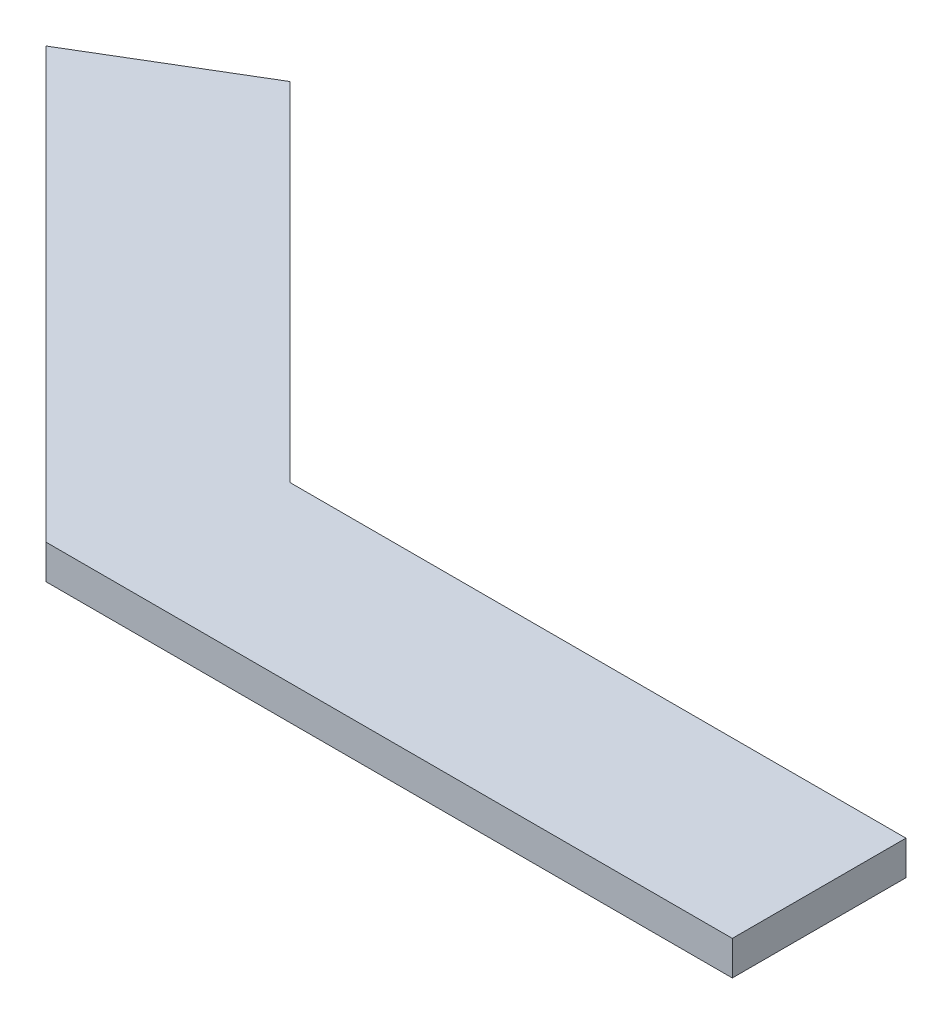
ISO-10303-21;
HEADER;
FILE_DESCRIPTION(('STEP AP214'),'2;1');
FILE_NAME('part.step','',(''),(''),'','','');
FILE_SCHEMA(('AUTOMOTIVE_DESIGN { 1 0 10303 214 1 1 1 1 }'));
ENDSEC;
DATA;
#1=APPLICATION_CONTEXT('core data for automotive mechanical design processes');
#2=APPLICATION_PROTOCOL_DEFINITION('international standard','automotive_design',2000,#1);
#3=PRODUCT_CONTEXT('',#1,'mechanical');
#4=PRODUCT('Part','Part','',(#3));
#5=PRODUCT_RELATED_PRODUCT_CATEGORY('part','',(#4));
#6=PRODUCT_DEFINITION_FORMATION('','',#4);
#7=PRODUCT_DEFINITION_CONTEXT('part definition',#1,'design');
#8=PRODUCT_DEFINITION('design','',#6,#7);
#9=PRODUCT_DEFINITION_SHAPE('','',#8);
#10=(LENGTH_UNIT() NAMED_UNIT(*) SI_UNIT(.MILLI.,.METRE.));
#11=(NAMED_UNIT(*) PLANE_ANGLE_UNIT() SI_UNIT($,.RADIAN.));
#12=(NAMED_UNIT(*) SI_UNIT($,.STERADIAN.) SOLID_ANGLE_UNIT());
#13=UNCERTAINTY_MEASURE_WITH_UNIT(LENGTH_MEASURE(1.E-05),#10,'distance_accuracy_value','');
#14=(GEOMETRIC_REPRESENTATION_CONTEXT(3) GLOBAL_UNCERTAINTY_ASSIGNED_CONTEXT((#13)) GLOBAL_UNIT_ASSIGNED_CONTEXT((#10,
#11,#12)) REPRESENTATION_CONTEXT('',''));
#15=CARTESIAN_POINT('',(0.,0.,0.));
#16=DIRECTION('',(0.,0.,1.));
#17=DIRECTION('',(1.,0.,0.));
#18=AXIS2_PLACEMENT_3D('',#15,#16,#17);
#19=CARTESIAN_POINT('',(0.,-25.3,100.));
#20=DIRECTION('',(0.,0.,-1.));
#21=DIRECTION('',(-1.,0.,0.));
#22=AXIS2_PLACEMENT_3D('',#19,#20,#21);
#23=PLANE('',#22);
#24=DIRECTION('',(-1.,0.,0.));
#25=VECTOR('',#24,1.);
#26=CARTESIAN_POINT('',(0.,-20.3,100.));
#27=LINE('',#26,#25);
#28=CARTESIAN_POINT('',(100.,-20.3,100.));
#29=VERTEX_POINT('',#28);
#30=CARTESIAN_POINT('',(0.,-20.3,100.));
#31=VERTEX_POINT('',#30);
#32=EDGE_CURVE('E117',#29,#31,#27,.T.);
#33=ORIENTED_EDGE('',*,*,#32,.T.);
#34=DIRECTION('',(0.,1.,0.));
#35=VECTOR('',#34,1.);
#36=CARTESIAN_POINT('',(0.,-25.3,100.));
#37=LINE('',#36,#35);
#38=CARTESIAN_POINT('',(0.,-25.3,100.));
#39=VERTEX_POINT('',#38);
#40=EDGE_CURVE('E11',#39,#31,#37,.T.);
#41=ORIENTED_EDGE('',*,*,#40,.F.);
#42=DIRECTION('',(-1.,0.,0.));
#43=VECTOR('',#42,1.);
#44=CARTESIAN_POINT('',(0.,-25.3,100.));
#45=LINE('',#44,#43);
#46=CARTESIAN_POINT('',(100.,-25.3,100.));
#47=VERTEX_POINT('',#46);
#48=EDGE_CURVE('E127',#47,#39,#45,.T.);
#49=ORIENTED_EDGE('',*,*,#48,.F.);
#50=DIRECTION('',(0.,1.,0.));
#51=VECTOR('',#50,1.);
#52=CARTESIAN_POINT('',(100.,-25.3,100.));
#53=LINE('',#52,#51);
#54=EDGE_CURVE('E113',#47,#29,#53,.T.);
#55=ORIENTED_EDGE('',*,*,#54,.T.);
#56=EDGE_LOOP('',(#33,#41,#49,#55));
#57=FACE_BOUND('',#56,.T.);
#58=ADVANCED_FACE('F33',(#57),#23,.F.);
#59=CARTESIAN_POINT('',(0.,-25.3,100.));
#60=DIRECTION('',(0.707106781186549,0.,-0.707106781186546));
#61=DIRECTION('',(-0.707106781186546,0.,-0.707106781186549));
#62=AXIS2_PLACEMENT_3D('',#59,#60,#61);
#63=PLANE('',#62);
#64=DIRECTION('',(-0.707106781186546,0.,-0.707106781186549));
#65=VECTOR('',#64,1.);
#66=CARTESIAN_POINT('',(0.,-20.3,100.));
#67=LINE('',#66,#65);
#68=CARTESIAN_POINT('',(-62.6139891086387,-20.3,37.386010891361));
#69=VERTEX_POINT('',#68);
#70=EDGE_CURVE('E120',#31,#69,#67,.T.);
#71=ORIENTED_EDGE('',*,*,#70,.T.);
#72=DIRECTION('',(0.,1.,0.));
#73=VECTOR('',#72,1.);
#74=CARTESIAN_POINT('',(-62.6139891086387,-25.3,37.386010891361));
#75=LINE('',#74,#73);
#76=CARTESIAN_POINT('',(-62.6139891086387,-25.3,37.386010891361));
#77=VERTEX_POINT('',#76);
#78=EDGE_CURVE('E41',#77,#69,#75,.T.);
#79=ORIENTED_EDGE('',*,*,#78,.F.);
#80=DIRECTION('',(-0.707106781186546,0.,-0.707106781186549));
#81=VECTOR('',#80,1.);
#82=CARTESIAN_POINT('',(0.,-25.3,100.));
#83=LINE('',#82,#81);
#84=EDGE_CURVE('E86',#39,#77,#83,.T.);
#85=ORIENTED_EDGE('',*,*,#84,.F.);
#86=ORIENTED_EDGE('',*,*,#40,.T.);
#87=EDGE_LOOP('',(#71,#79,#85,#86));
#88=FACE_BOUND('',#87,.T.);
#89=ADVANCED_FACE('F151',(#88),#63,.F.);
#90=CARTESIAN_POINT('',(-62.6139891086387,-25.3,37.386010891361));
#91=DIRECTION('',(0.512655659869584,0.,0.858594301404151));
#92=DIRECTION('',(0.858594301404151,0.,-0.512655659869584));
#93=AXIS2_PLACEMENT_3D('',#90,#91,#92);
#94=PLANE('',#93);
#95=DIRECTION('',(0.858594301404151,0.,-0.512655659869584));
#96=VECTOR('',#95,1.);
#97=CARTESIAN_POINT('',(-62.6139891086387,-20.3,37.386010891361));
#98=LINE('',#97,#96);
#99=CARTESIAN_POINT('',(-40.3454584254993,-20.3,24.0897564519582));
#100=VERTEX_POINT('',#99);
#101=EDGE_CURVE('E122',#69,#100,#98,.T.);
#102=ORIENTED_EDGE('',*,*,#101,.T.);
#103=DIRECTION('',(0.,1.,0.));
#104=VECTOR('',#103,1.);
#105=CARTESIAN_POINT('',(-40.3454584254993,-25.3,24.0897564519582));
#106=LINE('',#105,#104);
#107=CARTESIAN_POINT('',(-40.3454584254993,-25.3,24.0897564519582));
#108=VERTEX_POINT('',#107);
#109=EDGE_CURVE('E108',#108,#100,#106,.T.);
#110=ORIENTED_EDGE('',*,*,#109,.F.);
#111=DIRECTION('',(0.858594301404151,0.,-0.512655659869584));
#112=VECTOR('',#111,1.);
#113=CARTESIAN_POINT('',(-62.6139891086387,-25.3,37.386010891361));
#114=LINE('',#113,#112);
#115=EDGE_CURVE('E99',#77,#108,#114,.T.);
#116=ORIENTED_EDGE('',*,*,#115,.F.);
#117=ORIENTED_EDGE('',*,*,#78,.T.);
#118=EDGE_LOOP('',(#102,#110,#116,#117));
#119=FACE_BOUND('',#118,.T.);
#120=ADVANCED_FACE('F133',(#119),#94,.F.);
#121=CARTESIAN_POINT('',(10.2647851225425,-25.3,74.7));
#122=DIRECTION('',(-0.707106781186548,0.,0.707106781186548));
#123=DIRECTION('',(0.707106781186548,0.,0.707106781186548));
#124=AXIS2_PLACEMENT_3D('',#121,#122,#123);
#125=PLANE('',#124);
#126=DIRECTION('',(0.707106781186547,0.,0.707106781186547));
#127=VECTOR('',#126,1.);
#128=CARTESIAN_POINT('',(10.2647851225425,-20.3,74.7));
#129=LINE('',#128,#127);
#130=CARTESIAN_POINT('',(10.2647851225425,-20.3,74.7));
#131=VERTEX_POINT('',#130);
#132=EDGE_CURVE('E107',#100,#131,#129,.T.);
#133=ORIENTED_EDGE('',*,*,#132,.T.);
#134=DIRECTION('',(0.,1.,0.));
#135=VECTOR('',#134,1.);
#136=CARTESIAN_POINT('',(10.2647851225425,-25.3,74.7));
#137=LINE('',#136,#135);
#138=CARTESIAN_POINT('',(10.2647851225425,-25.3,74.7));
#139=VERTEX_POINT('',#138);
#140=EDGE_CURVE('E104',#139,#131,#137,.T.);
#141=ORIENTED_EDGE('',*,*,#140,.F.);
#142=DIRECTION('',(0.707106781186547,0.,0.707106781186547));
#143=VECTOR('',#142,1.);
#144=CARTESIAN_POINT('',(10.2647851225425,-25.3,74.7));
#145=LINE('',#144,#143);
#146=EDGE_CURVE('E93',#108,#139,#145,.T.);
#147=ORIENTED_EDGE('',*,*,#146,.F.);
#148=ORIENTED_EDGE('',*,*,#109,.T.);
#149=EDGE_LOOP('',(#133,#141,#147,#148));
#150=FACE_BOUND('',#149,.T.);
#151=ADVANCED_FACE('F105',(#150),#125,.F.);
#152=CARTESIAN_POINT('',(100.,-25.3,74.7));
#153=DIRECTION('',(0.,0.,1.));
#154=DIRECTION('',(1.,0.,0.));
#155=AXIS2_PLACEMENT_3D('',#152,#153,#154);
#156=PLANE('',#155);
#157=DIRECTION('',(1.,0.,0.));
#158=VECTOR('',#157,1.);
#159=CARTESIAN_POINT('',(100.,-20.3,74.7));
#160=LINE('',#159,#158);
#161=CARTESIAN_POINT('',(100.,-20.3,74.7));
#162=VERTEX_POINT('',#161);
#163=EDGE_CURVE('E72',#131,#162,#160,.T.);
#164=ORIENTED_EDGE('',*,*,#163,.T.);
#165=DIRECTION('',(0.,1.,0.));
#166=VECTOR('',#165,1.);
#167=CARTESIAN_POINT('',(100.,-25.3,74.7));
#168=LINE('',#167,#166);
#169=CARTESIAN_POINT('',(100.,-25.3,74.7));
#170=VERTEX_POINT('',#169);
#171=EDGE_CURVE('E109',#170,#162,#168,.T.);
#172=ORIENTED_EDGE('',*,*,#171,.F.);
#173=DIRECTION('',(1.,0.,0.));
#174=VECTOR('',#173,1.);
#175=CARTESIAN_POINT('',(100.,-25.3,74.7));
#176=LINE('',#175,#174);
#177=EDGE_CURVE('E97',#139,#170,#176,.T.);
#178=ORIENTED_EDGE('',*,*,#177,.F.);
#179=ORIENTED_EDGE('',*,*,#140,.T.);
#180=EDGE_LOOP('',(#164,#172,#178,#179));
#181=FACE_BOUND('',#180,.T.);
#182=ADVANCED_FACE('F111',(#181),#156,.F.);
#183=CARTESIAN_POINT('',(100.,-25.3,100.));
#184=DIRECTION('',(-1.,0.,0.));
#185=DIRECTION('',(0.,0.,1.));
#186=AXIS2_PLACEMENT_3D('',#183,#184,#185);
#187=PLANE('',#186);
#188=DIRECTION('',(0.,0.,1.));
#189=VECTOR('',#188,1.);
#190=CARTESIAN_POINT('',(100.,-20.3,100.));
#191=LINE('',#190,#189);
#192=EDGE_CURVE('E78',#162,#29,#191,.T.);
#193=ORIENTED_EDGE('',*,*,#192,.T.);
#194=ORIENTED_EDGE('',*,*,#54,.F.);
#195=DIRECTION('',(0.,0.,1.));
#196=VECTOR('',#195,1.);
#197=CARTESIAN_POINT('',(100.,-25.3,100.));
#198=LINE('',#197,#196);
#199=EDGE_CURVE('E49',#170,#47,#198,.T.);
#200=ORIENTED_EDGE('',*,*,#199,.F.);
#201=ORIENTED_EDGE('',*,*,#171,.T.);
#202=EDGE_LOOP('',(#193,#194,#200,#201));
#203=FACE_BOUND('',#202,.T.);
#204=ADVANCED_FACE('F140',(#203),#187,.F.);
#205=CARTESIAN_POINT('',(0.,-25.3,0.));
#206=DIRECTION('',(0.,1.,0.));
#207=DIRECTION('',(0.,0.,1.));
#208=AXIS2_PLACEMENT_3D('',#205,#206,#207);
#209=PLANE('',#208);
#210=ORIENTED_EDGE('',*,*,#48,.T.);
#211=ORIENTED_EDGE('',*,*,#84,.T.);
#212=ORIENTED_EDGE('',*,*,#115,.T.);
#213=ORIENTED_EDGE('',*,*,#146,.T.);
#214=ORIENTED_EDGE('',*,*,#177,.T.);
#215=ORIENTED_EDGE('',*,*,#199,.T.);
#216=EDGE_LOOP('',(#210,#211,#212,#213,#214,#215));
#217=FACE_BOUND('',#216,.T.);
#218=ADVANCED_FACE('F95',(#217),#209,.F.);
#219=CARTESIAN_POINT('',(0.,-20.3,0.));
#220=DIRECTION('',(0.,1.,0.));
#221=DIRECTION('',(0.,0.,1.));
#222=AXIS2_PLACEMENT_3D('',#219,#220,#221);
#223=PLANE('',#222);
#224=ORIENTED_EDGE('',*,*,#32,.F.);
#225=ORIENTED_EDGE('',*,*,#192,.F.);
#226=ORIENTED_EDGE('',*,*,#163,.F.);
#227=ORIENTED_EDGE('',*,*,#132,.F.);
#228=ORIENTED_EDGE('',*,*,#101,.F.);
#229=ORIENTED_EDGE('',*,*,#70,.F.);
#230=EDGE_LOOP('',(#224,#225,#226,#227,#228,#229));
#231=FACE_BOUND('',#230,.T.);
#232=ADVANCED_FACE('F136',(#231),#223,.T.);
#233=CLOSED_SHELL('',(#58,#89,#120,#151,#182,#204,#218,#232));
#234=MANIFOLD_SOLID_BREP('B2',#233);
#235=ADVANCED_BREP_SHAPE_REPRESENTATION('',(#18,#234),#14);
#236=SHAPE_DEFINITION_REPRESENTATION(#9,#235);
ENDSEC;
END-ISO-10303-21;
